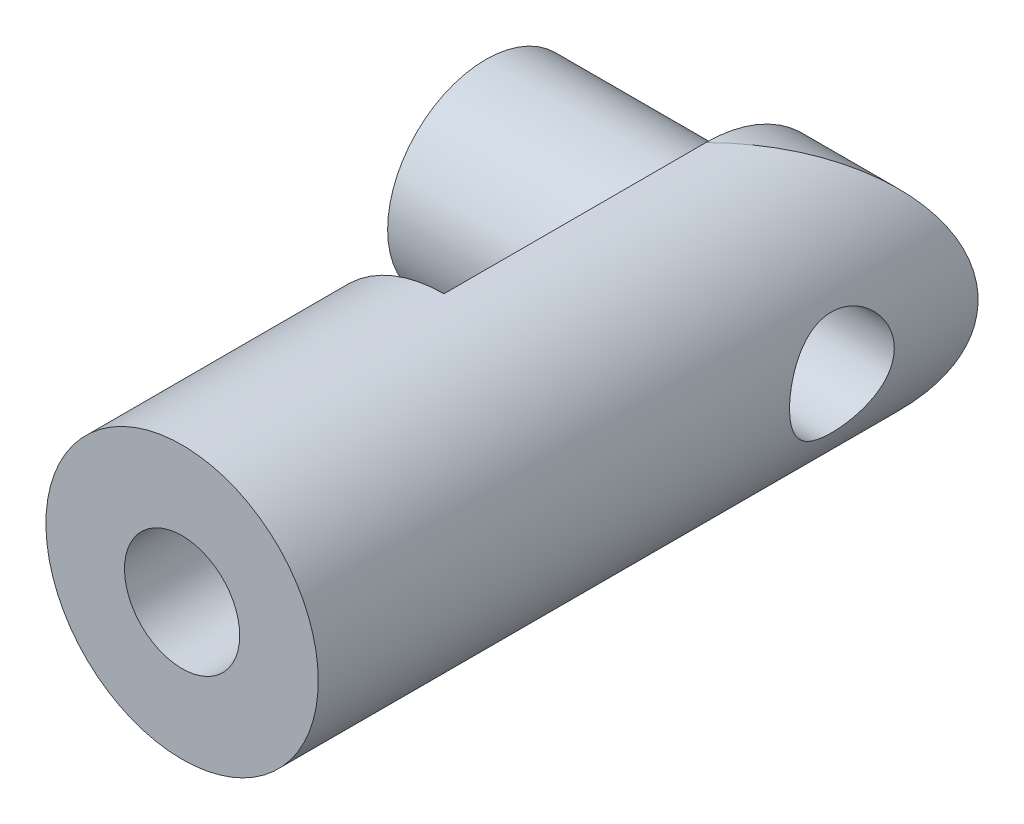
ISO-10303-21;
HEADER;
FILE_DESCRIPTION(('STEP AP214'),'2;1');
FILE_NAME('part.step','',(''),(''),'','','');
FILE_SCHEMA(('AUTOMOTIVE_DESIGN { 1 0 10303 214 1 1 1 1 }'));
ENDSEC;
DATA;
#1=APPLICATION_CONTEXT('core data for automotive mechanical design processes');
#2=APPLICATION_PROTOCOL_DEFINITION('international standard','automotive_design',2000,#1);
#3=PRODUCT_CONTEXT('',#1,'mechanical');
#4=PRODUCT('Part','Part','',(#3));
#5=PRODUCT_RELATED_PRODUCT_CATEGORY('part','',(#4));
#6=PRODUCT_DEFINITION_FORMATION('','',#4);
#7=PRODUCT_DEFINITION_CONTEXT('part definition',#1,'design');
#8=PRODUCT_DEFINITION('design','',#6,#7);
#9=PRODUCT_DEFINITION_SHAPE('','',#8);
#10=(LENGTH_UNIT() NAMED_UNIT(*) SI_UNIT(.MILLI.,.METRE.));
#11=(NAMED_UNIT(*) PLANE_ANGLE_UNIT() SI_UNIT($,.RADIAN.));
#12=(NAMED_UNIT(*) SI_UNIT($,.STERADIAN.) SOLID_ANGLE_UNIT());
#13=UNCERTAINTY_MEASURE_WITH_UNIT(LENGTH_MEASURE(1.E-05),#10,'distance_accuracy_value','');
#14=(GEOMETRIC_REPRESENTATION_CONTEXT(3) GLOBAL_UNCERTAINTY_ASSIGNED_CONTEXT((#13)) GLOBAL_UNIT_ASSIGNED_CONTEXT((#10,
#11,#12)) REPRESENTATION_CONTEXT('',''));
#15=CARTESIAN_POINT('',(0.,0.,0.));
#16=DIRECTION('',(0.,0.,1.));
#17=DIRECTION('',(1.,0.,0.));
#18=AXIS2_PLACEMENT_3D('',#15,#16,#17);
#19=CARTESIAN_POINT('',(0.,0.,5.));
#20=DIRECTION('',(0.,0.,1.));
#21=DIRECTION('',(1.,0.,0.));
#22=AXIS2_PLACEMENT_3D('',#19,#20,#21);
#23=PLANE('',#22);
#24=CARTESIAN_POINT('',(0.,0.,5.));
#25=DIRECTION('',(0.,0.,1.));
#26=DIRECTION('',(1.,0.,0.));
#27=AXIS2_PLACEMENT_3D('',#24,#25,#26);
#28=CIRCLE('',#27,2.6);
#29=CARTESIAN_POINT('',(2.6,0.,5.));
#30=VERTEX_POINT('',#29);
#31=EDGE_CURVE('E56',#30,#30,#28,.T.);
#32=ORIENTED_EDGE('',*,*,#31,.T.);
#33=EDGE_LOOP('',(#32));
#34=FACE_BOUND('',#33,.T.);
#35=CARTESIAN_POINT('',(0.,0.,5.));
#36=DIRECTION('',(0.,0.,1.));
#37=DIRECTION('',(1.,0.,0.));
#38=AXIS2_PLACEMENT_3D('',#35,#36,#37);
#39=CIRCLE('',#38,1.1);
#40=CARTESIAN_POINT('',(1.1,0.,5.));
#41=VERTEX_POINT('',#40);
#42=EDGE_CURVE('E100',#41,#41,#39,.T.);
#43=ORIENTED_EDGE('',*,*,#42,.F.);
#44=EDGE_LOOP('',(#43));
#45=FACE_BOUND('',#44,.T.);
#46=ADVANCED_FACE('F45',(#34,#45),#23,.T.);
#47=CARTESIAN_POINT('',(0.,0.,0.));
#48=DIRECTION('',(0.,0.,1.));
#49=DIRECTION('',(1.,0.,0.));
#50=AXIS2_PLACEMENT_3D('',#47,#48,#49);
#51=PLANE('',#50);
#52=CARTESIAN_POINT('',(0.,0.,0.));
#53=DIRECTION('',(0.,0.,1.));
#54=DIRECTION('',(1.,0.,0.));
#55=AXIS2_PLACEMENT_3D('',#52,#53,#54);
#56=CIRCLE('',#55,2.6);
#57=CARTESIAN_POINT('',(0.,2.6,0.));
#58=VERTEX_POINT('',#57);
#59=CARTESIAN_POINT('',(0.,-2.6,0.));
#60=VERTEX_POINT('',#59);
#61=EDGE_CURVE('E50',#58,#60,#56,.T.);
#62=ORIENTED_EDGE('',*,*,#61,.F.);
#63=DIRECTION('',(0.,-1.,0.));
#64=VECTOR('',#63,1.);
#65=CARTESIAN_POINT('',(0.,2.6,0.));
#66=LINE('',#65,#64);
#67=CARTESIAN_POINT('',(0.,1.1,0.));
#68=VERTEX_POINT('',#67);
#69=EDGE_CURVE('E58',#58,#68,#66,.T.);
#70=ORIENTED_EDGE('',*,*,#69,.T.);
#71=CARTESIAN_POINT('',(0.,0.,0.));
#72=DIRECTION('',(0.,0.,1.));
#73=DIRECTION('',(1.,0.,0.));
#74=AXIS2_PLACEMENT_3D('',#71,#72,#73);
#75=CIRCLE('',#74,1.1);
#76=CARTESIAN_POINT('',(0.,-1.1,0.));
#77=VERTEX_POINT('',#76);
#78=EDGE_CURVE('E105',#68,#77,#75,.T.);
#79=ORIENTED_EDGE('',*,*,#78,.T.);
#80=EDGE_CURVE('E11',#77,#60,#66,.T.);
#81=ORIENTED_EDGE('',*,*,#80,.T.);
#82=EDGE_LOOP('',(#62,#70,#79,#81));
#83=FACE_BOUND('',#82,.T.);
#84=ADVANCED_FACE('F98',(#83),#51,.F.);
#85=CARTESIAN_POINT('',(0.,0.,5.));
#86=DIRECTION('',(0.,0.,-1.));
#87=DIRECTION('',(-1.,0.,0.));
#88=AXIS2_PLACEMENT_3D('',#85,#86,#87);
#89=CYLINDRICAL_SURFACE('',#88,2.6);
#90=CARTESIAN_POINT('',(2.6,0.,-4.));
#91=CARTESIAN_POINT('',(2.6000018519452,0.0540572255897881,-3.99999757094623));
#92=CARTESIAN_POINT('',(2.59829968731883,0.108098273476071,-4.00439680413288));
#93=CARTESIAN_POINT('',(2.59168024200562,0.214559957470542,-4.02180187187692));
#94=CARTESIAN_POINT('',(2.5867636048773,0.266980915731733,-4.03480598368736));
#95=CARTESIAN_POINT('',(2.57424131730655,0.36865120129008,-4.068889237263));
#96=CARTESIAN_POINT('',(2.56664102039747,0.417906613861108,-4.08995230944821));
#97=CARTESIAN_POINT('',(2.54950397077244,0.512179635605283,-4.13947163468897));
#98=CARTESIAN_POINT('',(2.53996667169028,0.557196043835878,-4.16792997434681));
#99=CARTESIAN_POINT('',(2.51946315193127,0.643709034698175,-4.23274782860148));
#100=CARTESIAN_POINT('',(2.50845506157042,0.684993091884412,-4.26937762466553));
#101=CARTESIAN_POINT('',(2.48645115305503,0.761005493650115,-4.34892483552317));
#102=CARTESIAN_POINT('',(2.47545534012837,0.795731677333428,-4.39184431459607));
#103=CARTESIAN_POINT('',(2.45422698667959,0.859029366714562,-4.48486999167543));
#104=CARTESIAN_POINT('',(2.4440433938205,0.887294652405766,-4.53519685143732));
#105=CARTESIAN_POINT('',(2.42624767416415,0.934864756709347,-4.64034266392878));
#106=CARTESIAN_POINT('',(2.41863445981519,0.954173366273327,-4.69515970458973));
#107=CARTESIAN_POINT('',(2.40729092325006,0.982433051608146,-4.80527869449039));
#108=CARTESIAN_POINT('',(2.40340867672522,0.991791204803967,-4.86045998132311));
#109=CARTESIAN_POINT('',(2.3995235793221,1.00115679790077,-4.97173578399078));
#110=CARTESIAN_POINT('',(2.39951901750429,1.00116836177006,-5.02782988614137));
#111=CARTESIAN_POINT('',(2.40325935029452,0.992150625251773,-5.13554570326071));
#112=CARTESIAN_POINT('',(2.40676625173235,0.983695182825781,-5.18722528516591));
#113=CARTESIAN_POINT('',(2.41673736153133,0.958935224533736,-5.28836603176264));
#114=CARTESIAN_POINT('',(2.42320203922708,0.942629462971705,-5.33782684301543));
#115=CARTESIAN_POINT('',(2.43849748067643,0.902330655691605,-5.43426332471291));
#116=CARTESIAN_POINT('',(2.44737195677984,0.878193801906613,-5.48117166088676));
#117=CARTESIAN_POINT('',(2.46647347068484,0.823018446411293,-5.57043515140064));
#118=CARTESIAN_POINT('',(2.47670099157799,0.791977476943796,-5.61278866964917));
#119=CARTESIAN_POINT('',(2.49824138072185,0.721282061331731,-5.69490366449829));
#120=CARTESIAN_POINT('',(2.50957975535917,0.681172577797612,-5.734267687844));
#121=CARTESIAN_POINT('',(2.53144274730327,0.594794556182306,-5.80583226771338));
#122=CARTESIAN_POINT('',(2.54196722602226,0.548524972811994,-5.83803160600026));
#123=CARTESIAN_POINT('',(2.56124562692924,0.450083643020324,-5.89482201928597));
#124=CARTESIAN_POINT('',(2.56996636279778,0.397824839662638,-5.91927426303727));
#125=CARTESIAN_POINT('',(2.584406805744,0.289515866565402,-5.95890644101956));
#126=CARTESIAN_POINT('',(2.59012791769579,0.233467485585985,-5.97409071645225));
#127=CARTESIAN_POINT('',(2.59767409250017,0.122510349616942,-5.99397687270491));
#128=CARTESIAN_POINT('',(2.59969768819373,0.0677108709014878,-5.99921355158335));
#129=CARTESIAN_POINT('',(2.60023882438093,-0.0420152224278686,-6.00062137521469));
#130=CARTESIAN_POINT('',(2.59875719078575,-0.096941804046913,-5.99679465550879));
#131=CARTESIAN_POINT('',(2.59258501061184,-0.203009356593836,-5.98058596626393));
#132=CARTESIAN_POINT('',(2.58802802551057,-0.25421331145305,-5.96855987758747));
#133=CARTESIAN_POINT('',(2.57629918086572,-0.353836444967817,-5.93676830779947));
#134=CARTESIAN_POINT('',(2.56912698220924,-0.402255261533358,-5.91700182297165));
#135=CARTESIAN_POINT('',(2.55260465149125,-0.496559050909407,-5.86965295390666));
#136=CARTESIAN_POINT('',(2.54319579239697,-0.542324916390916,-5.84185447424895));
#137=CARTESIAN_POINT('',(2.52323325200288,-0.628698883784229,-5.77947314874901));
#138=CARTESIAN_POINT('',(2.51267913392668,-0.669305004975895,-5.74488771041732));
#139=CARTESIAN_POINT('',(2.49078392931945,-0.746803465383581,-5.66743209972667));
#140=CARTESIAN_POINT('',(2.47943414248048,-0.783317599615753,-5.62418498441232));
#141=CARTESIAN_POINT('',(2.45783995142123,-0.848651923026256,-5.53196183894319));
#142=CARTESIAN_POINT('',(2.44759567559697,-0.877471219084111,-5.48298514471857));
#143=CARTESIAN_POINT('',(2.42939479548453,-0.926680663543774,-5.38016958104119));
#144=CARTESIAN_POINT('',(2.42145253308655,-0.947018300290362,-5.32630286430611));
#145=CARTESIAN_POINT('',(2.40903061102687,-0.978191451146207,-5.21551575779863));
#146=CARTESIAN_POINT('',(2.4045486557857,-0.989033265459291,-5.15859741933599));
#147=CARTESIAN_POINT('',(2.3998700107445,-1.00032884213179,-5.04744455965273));
#148=CARTESIAN_POINT('',(2.39940553725393,-1.00143185177305,-4.99328679237215));
#149=CARTESIAN_POINT('',(2.40212218991402,-0.994897651408334,-4.88559956302612));
#150=CARTESIAN_POINT('',(2.40530293150439,-0.987261363374601,-4.83207003528493));
#151=CARTESIAN_POINT('',(2.41472356910405,-0.96398054696674,-4.72900157487891));
#152=CARTESIAN_POINT('',(2.42085647318887,-0.948615313587106,-4.67938891907524));
#153=CARTESIAN_POINT('',(2.43542302526286,-0.910564460638392,-4.58342008261629));
#154=CARTESIAN_POINT('',(2.44385726846956,-0.887876946959447,-4.53706474833935));
#155=CARTESIAN_POINT('',(2.46264591325751,-0.834397278020408,-4.4461858785703));
#156=CARTESIAN_POINT('',(2.47307974264819,-0.80323175771206,-4.40189870340971));
#157=CARTESIAN_POINT('',(2.49443082440166,-0.734246295961301,-4.31897611283639));
#158=CARTESIAN_POINT('',(2.50534823351688,-0.696424184795353,-4.28034254776745));
#159=CARTESIAN_POINT('',(2.52719842066789,-0.612575320876064,-4.20752984961241));
#160=CARTESIAN_POINT('',(2.53809523233955,-0.566199531741258,-4.17373997642417));
#161=CARTESIAN_POINT('',(2.5580153104653,-0.468042864948251,-4.11443565614288));
#162=CARTESIAN_POINT('',(2.56703826232546,-0.416261081891272,-4.08892259820371));
#163=CARTESIAN_POINT('',(2.58267655775064,-0.305160336892972,-4.04571823239251));
#164=CARTESIAN_POINT('',(2.58909628221719,-0.245570015012554,-4.02864624957801));
#165=CARTESIAN_POINT('',(2.59775574497678,-0.123978439137694,-4.00579175803016));
#166=CARTESIAN_POINT('',(2.59999787667709,-0.0619785864001374,-4.00000278499899));
#167=CARTESIAN_POINT('',(2.6,0.,-4.));
#168=B_SPLINE_CURVE_WITH_KNOTS('',3,(#90,#91,#92,#93,#94,#95,#96,#97,#98,#99,#100,#101,#102,
#103,#104,#105,#106,#107,#108,#109,#110,#111,#112,#113,#114,#115,#116,#117,#118,#119,#120,#121,
#122,#123,#124,#125,#126,#127,#128,#129,#130,#131,#132,#133,#134,#135,#136,#137,#138,#139,#140,
#141,#142,#143,#144,#145,#146,#147,#148,#149,#150,#151,#152,#153,#154,#155,#156,#157,#158,#159,
#160,#161,#162,#163,#164,#165,#166,#167),.UNSPECIFIED.,.T.,.F.,(4,2,2,2,2,2,2,2,2,2,2,2,2,2,2,2,
2,2,2,2,2,2,2,2,2,2,2,2,2,2,2,2,2,2,2,2,2,2,4),(0.,0.161942958269271,0.323853504418107,
0.485442869193375,0.647077876607743,0.815171613211465,0.983320642391472,1.15827963085093,
1.33316449944716,1.50058146431358,1.66792456024132,1.82464489235396,1.98139010119601,
2.1411942044595,2.30105551900065,2.47226539328757,2.64350435678846,2.81765802560298,
2.99173005650703,3.15614511591845,3.32052143928651,3.47818274565868,3.63586450313535,
3.79826264384224,3.96072293873294,4.13310397141675,4.30550500324368,4.47895810326659,
4.65229603480299,4.81398313242315,4.97565317406446,5.13186080767387,5.28810888112828,
5.45284612616128,5.61763716727515,5.79200340715963,5.96639889698712,6.15217889104948,
6.33785241612366),.UNSPECIFIED.);
#169=CARTESIAN_POINT('',(2.6,0.,-4.));
#170=VERTEX_POINT('',#169);
#171=EDGE_CURVE('E124',#170,#170,#168,.T.);
#172=ORIENTED_EDGE('',*,*,#171,.T.);
#173=EDGE_LOOP('',(#172));
#174=FACE_BOUND('',#173,.T.);
#175=ORIENTED_EDGE('',*,*,#31,.F.);
#176=EDGE_LOOP('',(#175));
#177=FACE_BOUND('',#176,.T.);
#178=ORIENTED_EDGE('',*,*,#61,.T.);
#179=DIRECTION('',(0.,0.,-1.));
#180=VECTOR('',#179,1.);
#181=CARTESIAN_POINT('',(0.,-2.6,0.));
#182=LINE('',#181,#180);
#183=CARTESIAN_POINT('',(0.,-2.6,-5.));
#184=VERTEX_POINT('',#183);
#185=EDGE_CURVE('E66',#60,#184,#182,.T.);
#186=ORIENTED_EDGE('',*,*,#185,.T.);
#187=CARTESIAN_POINT('',(0.,0.,-5.));
#188=DIRECTION('',(-0.707106781186547,0.,-0.707106781186547));
#189=DIRECTION('',(-0.707106781186547,0.,0.707106781186547));
#190=AXIS2_PLACEMENT_3D('',#187,#188,#189);
#191=ELLIPSE('',#190,3.67695526217005,2.6);
#192=CARTESIAN_POINT('',(0.,2.6,-5.));
#193=VERTEX_POINT('',#192);
#194=EDGE_CURVE('E87',#193,#184,#191,.T.);
#195=ORIENTED_EDGE('',*,*,#194,.F.);
#196=DIRECTION('',(0.,0.,1.));
#197=VECTOR('',#196,1.);
#198=CARTESIAN_POINT('',(0.,2.6,0.));
#199=LINE('',#198,#197);
#200=EDGE_CURVE('E83',#193,#58,#199,.T.);
#201=ORIENTED_EDGE('',*,*,#200,.T.);
#202=EDGE_LOOP('',(#178,#186,#195,#201));
#203=FACE_BOUND('',#202,.T.);
#204=ADVANCED_FACE('F47',(#174,#177,#203),#89,.T.);
#205=CARTESIAN_POINT('',(0.,0.,5.));
#206=DIRECTION('',(0.,0.,-1.));
#207=DIRECTION('',(-1.,0.,0.));
#208=AXIS2_PLACEMENT_3D('',#205,#206,#207);
#209=CYLINDRICAL_SURFACE('',#208,1.1);
#210=ORIENTED_EDGE('',*,*,#42,.T.);
#211=EDGE_LOOP('',(#210));
#212=FACE_BOUND('',#211,.T.);
#213=ORIENTED_EDGE('',*,*,#78,.F.);
#214=EDGE_CURVE('E110',#77,#68,#75,.T.);
#215=ORIENTED_EDGE('',*,*,#214,.F.);
#216=EDGE_LOOP('',(#213,#215));
#217=FACE_BOUND('',#216,.T.);
#218=ADVANCED_FACE('F159',(#212,#217),#209,.F.);
#219=CARTESIAN_POINT('',(2.601,2.6,0.));
#220=DIRECTION('',(0.,0.,-1.));
#221=DIRECTION('',(-1.,0.,0.));
#222=AXIS2_PLACEMENT_3D('',#219,#220,#221);
#223=PLANE('',#222);
#224=EDGE_CURVE('E59',#68,#77,#66,.T.);
#225=ORIENTED_EDGE('',*,*,#224,.T.);
#226=ORIENTED_EDGE('',*,*,#214,.T.);
#227=EDGE_LOOP('',(#225,#226));
#228=FACE_BOUND('',#227,.T.);
#229=ADVANCED_FACE('F152',(#228),#223,.F.);
#230=CARTESIAN_POINT('',(0.,0.,-5.));
#231=DIRECTION('',(-1.,0.,0.));
#232=DIRECTION('',(0.,0.,1.));
#233=AXIS2_PLACEMENT_3D('',#230,#231,#232);
#234=PLANE('',#233);
#235=CARTESIAN_POINT('',(0.,0.,-5.));
#236=DIRECTION('',(-1.,0.,0.));
#237=DIRECTION('',(0.,0.,1.));
#238=AXIS2_PLACEMENT_3D('',#235,#236,#237);
#239=CIRCLE('',#238,1.875);
#240=CARTESIAN_POINT('',(0.,0.,-3.125));
#241=VERTEX_POINT('',#240);
#242=EDGE_CURVE('E119',#241,#241,#239,.T.);
#243=ORIENTED_EDGE('',*,*,#242,.F.);
#244=EDGE_LOOP('',(#243));
#245=FACE_BOUND('',#244,.T.);
#246=ORIENTED_EDGE('',*,*,#69,.F.);
#247=ORIENTED_EDGE('',*,*,#200,.F.);
#248=CARTESIAN_POINT('',(0.,0.,-5.));
#249=DIRECTION('',(1.,0.,0.));
#250=DIRECTION('',(0.,0.,1.));
#251=AXIS2_PLACEMENT_3D('',#248,#249,#250);
#252=CIRCLE('',#251,2.6);
#253=EDGE_CURVE('E90',#184,#193,#252,.T.);
#254=ORIENTED_EDGE('',*,*,#253,.F.);
#255=ORIENTED_EDGE('',*,*,#185,.F.);
#256=ORIENTED_EDGE('',*,*,#80,.F.);
#257=ORIENTED_EDGE('',*,*,#224,.F.);
#258=EDGE_LOOP('',(#246,#247,#254,#255,#256,#257));
#259=FACE_BOUND('',#258,.T.);
#260=ADVANCED_FACE('F93',(#245,#259),#234,.T.);
#261=CARTESIAN_POINT('',(2.601,0.,-5.));
#262=DIRECTION('',(-1.,0.,0.));
#263=DIRECTION('',(0.,0.,1.));
#264=AXIS2_PLACEMENT_3D('',#261,#262,#263);
#265=CYLINDRICAL_SURFACE('',#264,2.6);
#266=ORIENTED_EDGE('',*,*,#253,.T.);
#267=ORIENTED_EDGE('',*,*,#194,.T.);
#268=EDGE_LOOP('',(#266,#267));
#269=FACE_BOUND('',#268,.T.);
#270=ADVANCED_FACE('F148',(#269),#265,.T.);
#271=CARTESIAN_POINT('',(-4.2,0.,-5.));
#272=DIRECTION('',(1.,0.,0.));
#273=DIRECTION('',(0.,0.,-1.));
#274=AXIS2_PLACEMENT_3D('',#271,#272,#273);
#275=CYLINDRICAL_SURFACE('',#274,1.875);
#276=CARTESIAN_POINT('',(-4.2,0.,-5.));
#277=DIRECTION('',(-1.,0.,0.));
#278=DIRECTION('',(0.,0.,1.));
#279=AXIS2_PLACEMENT_3D('',#276,#277,#278);
#280=CIRCLE('',#279,1.875);
#281=CARTESIAN_POINT('',(-4.2,0.,-3.125));
#282=VERTEX_POINT('',#281);
#283=EDGE_CURVE('E123',#282,#282,#280,.T.);
#284=ORIENTED_EDGE('',*,*,#283,.F.);
#285=EDGE_LOOP('',(#284));
#286=FACE_BOUND('',#285,.T.);
#287=ORIENTED_EDGE('',*,*,#242,.T.);
#288=EDGE_LOOP('',(#287));
#289=FACE_BOUND('',#288,.T.);
#290=ADVANCED_FACE('F144',(#286,#289),#275,.T.);
#291=CARTESIAN_POINT('',(-4.2,0.,-5.));
#292=DIRECTION('',(-1.,0.,0.));
#293=DIRECTION('',(0.,0.,1.));
#294=AXIS2_PLACEMENT_3D('',#291,#292,#293);
#295=PLANE('',#294);
#296=CARTESIAN_POINT('',(-4.2,0.,-5.));
#297=DIRECTION('',(-1.,0.,0.));
#298=DIRECTION('',(0.,0.,1.));
#299=AXIS2_PLACEMENT_3D('',#296,#297,#298);
#300=CIRCLE('',#299,1.);
#301=CARTESIAN_POINT('',(-4.2,0.,-4.));
#302=VERTEX_POINT('',#301);
#303=EDGE_CURVE('E135',#302,#302,#300,.T.);
#304=ORIENTED_EDGE('',*,*,#303,.F.);
#305=EDGE_LOOP('',(#304));
#306=FACE_BOUND('',#305,.T.);
#307=ORIENTED_EDGE('',*,*,#283,.T.);
#308=EDGE_LOOP('',(#307));
#309=FACE_BOUND('',#308,.T.);
#310=ADVANCED_FACE('F140',(#306,#309),#295,.T.);
#311=CARTESIAN_POINT('',(2.6,0.,-5.));
#312=DIRECTION('',(-1.,0.,0.));
#313=DIRECTION('',(0.,0.,1.));
#314=AXIS2_PLACEMENT_3D('',#311,#312,#313);
#315=CYLINDRICAL_SURFACE('',#314,1.);
#316=ORIENTED_EDGE('',*,*,#303,.T.);
#317=EDGE_LOOP('',(#316));
#318=FACE_BOUND('',#317,.T.);
#319=ORIENTED_EDGE('',*,*,#171,.F.);
#320=EDGE_LOOP('',(#319));
#321=FACE_BOUND('',#320,.T.);
#322=ADVANCED_FACE('F136',(#318,#321),#315,.F.);
#323=CLOSED_SHELL('',(#46,#84,#204,#218,#229,#260,#270,#290,#310,#322));
#324=MANIFOLD_SOLID_BREP('B2',#323);
#325=ADVANCED_BREP_SHAPE_REPRESENTATION('',(#18,#324),#14);
#326=SHAPE_DEFINITION_REPRESENTATION(#9,#325);
ENDSEC;
END-ISO-10303-21;
